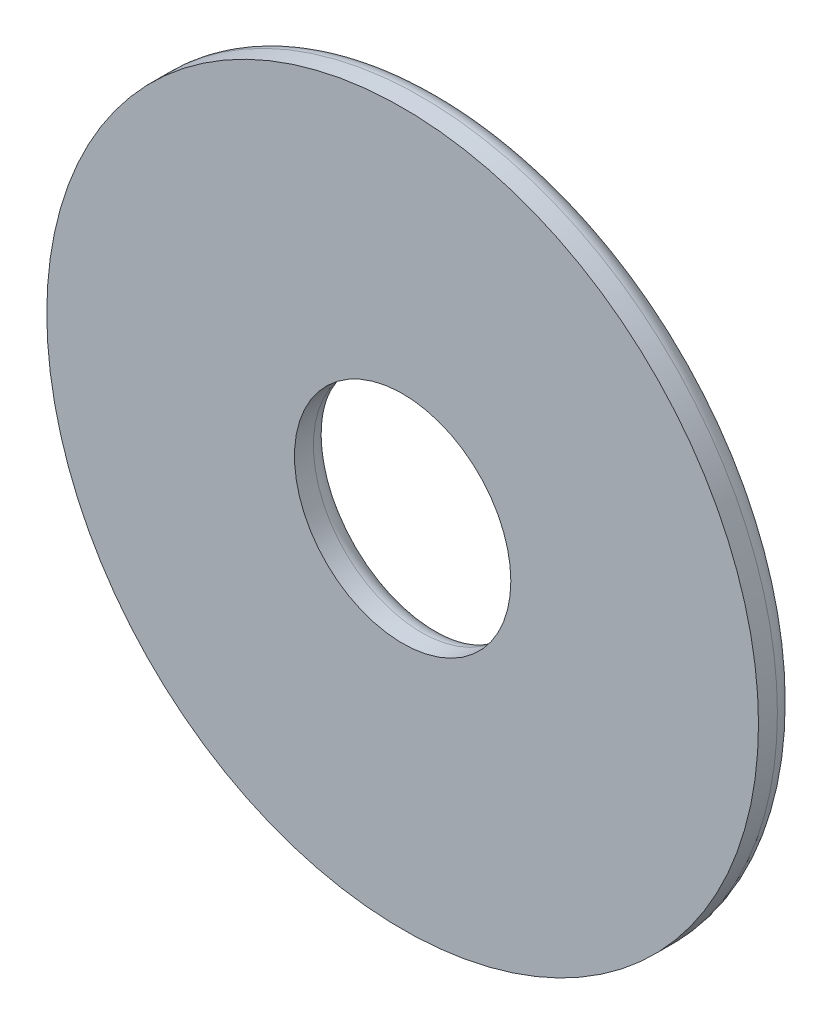
ISO-10303-21;
HEADER;
FILE_DESCRIPTION(('STEP AP214'),'2;1');
FILE_NAME('part.step','',(''),(''),'','','');
FILE_SCHEMA(('AUTOMOTIVE_DESIGN { 1 0 10303 214 1 1 1 1 }'));
ENDSEC;
DATA;
#1=APPLICATION_CONTEXT('core data for automotive mechanical design processes');
#2=APPLICATION_PROTOCOL_DEFINITION('international standard','automotive_design',2000,#1);
#3=PRODUCT_CONTEXT('',#1,'mechanical');
#4=PRODUCT('Part','Part','',(#3));
#5=PRODUCT_RELATED_PRODUCT_CATEGORY('part','',(#4));
#6=PRODUCT_DEFINITION_FORMATION('','',#4);
#7=PRODUCT_DEFINITION_CONTEXT('part definition',#1,'design');
#8=PRODUCT_DEFINITION('design','',#6,#7);
#9=PRODUCT_DEFINITION_SHAPE('','',#8);
#10=(LENGTH_UNIT() NAMED_UNIT(*) SI_UNIT(.MILLI.,.METRE.));
#11=(NAMED_UNIT(*) PLANE_ANGLE_UNIT() SI_UNIT($,.RADIAN.));
#12=(NAMED_UNIT(*) SI_UNIT($,.STERADIAN.) SOLID_ANGLE_UNIT());
#13=UNCERTAINTY_MEASURE_WITH_UNIT(LENGTH_MEASURE(1.E-05),#10,'distance_accuracy_value','');
#14=(GEOMETRIC_REPRESENTATION_CONTEXT(3) GLOBAL_UNCERTAINTY_ASSIGNED_CONTEXT((#13)) GLOBAL_UNIT_ASSIGNED_CONTEXT((#10,
#11,#12)) REPRESENTATION_CONTEXT('',''));
#15=CARTESIAN_POINT('',(0.,0.,0.));
#16=DIRECTION('',(0.,0.,1.));
#17=DIRECTION('',(1.,0.,0.));
#18=AXIS2_PLACEMENT_3D('',#15,#16,#17);
#19=CARTESIAN_POINT('',(0.,0.,0.590549999999995));
#20=DIRECTION('',(0.,0.,1.));
#21=DIRECTION('',(1.,0.,0.));
#22=AXIS2_PLACEMENT_3D('',#19,#20,#21);
#23=PLANE('',#22);
#24=CARTESIAN_POINT('',(0.,0.,0.590549999999995));
#25=DIRECTION('',(0.,0.,1.));
#26=DIRECTION('',(1.,0.,0.));
#27=AXIS2_PLACEMENT_3D('',#24,#25,#26);
#28=CIRCLE('',#27,11.1125);
#29=CARTESIAN_POINT('',(11.1125,0.,0.590549999999995));
#30=VERTEX_POINT('',#29);
#31=EDGE_CURVE('E54',#30,#30,#28,.T.);
#32=ORIENTED_EDGE('',*,*,#31,.T.);
#33=EDGE_LOOP('',(#32));
#34=FACE_BOUND('',#33,.T.);
#35=CARTESIAN_POINT('',(0.,0.,0.590549999999995));
#36=DIRECTION('',(0.,0.,1.));
#37=DIRECTION('',(1.,0.,0.));
#38=AXIS2_PLACEMENT_3D('',#35,#36,#37);
#39=CIRCLE('',#38,3.3782);
#40=CARTESIAN_POINT('',(3.3782,0.,0.590549999999995));
#41=VERTEX_POINT('',#40);
#42=EDGE_CURVE('E59',#41,#41,#39,.T.);
#43=ORIENTED_EDGE('',*,*,#42,.F.);
#44=EDGE_LOOP('',(#43));
#45=FACE_BOUND('',#44,.T.);
#46=ADVANCED_FACE('F34',(#34,#45),#23,.T.);
#47=CARTESIAN_POINT('',(0.,0.,0.590549999999995));
#48=DIRECTION('',(0.,0.,-1.));
#49=DIRECTION('',(-1.,0.,0.));
#50=AXIS2_PLACEMENT_3D('',#47,#48,#49);
#51=CYLINDRICAL_SURFACE('',#50,11.1125);
#52=CARTESIAN_POINT('',(0.,0.,0.));
#53=DIRECTION('',(0.,0.,1.));
#54=DIRECTION('',(1.,0.,0.));
#55=AXIS2_PLACEMENT_3D('',#52,#53,#54);
#56=CIRCLE('',#55,11.1125);
#57=CARTESIAN_POINT('',(11.1125,0.,0.));
#58=VERTEX_POINT('',#57);
#59=EDGE_CURVE('E49',#58,#58,#56,.T.);
#60=ORIENTED_EDGE('',*,*,#59,.T.);
#61=EDGE_LOOP('',(#60));
#62=FACE_BOUND('',#61,.T.);
#63=ORIENTED_EDGE('',*,*,#31,.F.);
#64=EDGE_LOOP('',(#63));
#65=FACE_BOUND('',#64,.T.);
#66=ADVANCED_FACE('F63',(#62,#65),#51,.T.);
#67=CARTESIAN_POINT('',(0.,0.,0.590549999999995));
#68=DIRECTION('',(0.,0.,-1.));
#69=DIRECTION('',(-1.,0.,0.));
#70=AXIS2_PLACEMENT_3D('',#67,#68,#69);
#71=CYLINDRICAL_SURFACE('',#70,3.3782);
#72=CARTESIAN_POINT('',(0.,0.,0.));
#73=DIRECTION('',(0.,0.,1.));
#74=DIRECTION('',(1.,0.,0.));
#75=AXIS2_PLACEMENT_3D('',#72,#73,#74);
#76=CIRCLE('',#75,3.3782);
#77=CARTESIAN_POINT('',(3.3782,0.,0.));
#78=VERTEX_POINT('',#77);
#79=EDGE_CURVE('E10',#78,#78,#76,.F.);
#80=ORIENTED_EDGE('',*,*,#79,.T.);
#81=EDGE_LOOP('',(#80));
#82=FACE_BOUND('',#81,.T.);
#83=ORIENTED_EDGE('',*,*,#42,.T.);
#84=EDGE_LOOP('',(#83));
#85=FACE_BOUND('',#84,.T.);
#86=ADVANCED_FACE('F65',(#82,#85),#71,.F.);
#87=CARTESIAN_POINT('',(0.,0.,-0.590549999999995));
#88=DIRECTION('',(0.,0.,1.));
#89=DIRECTION('',(1.,0.,0.));
#90=AXIS2_PLACEMENT_3D('',#87,#88,#89);
#91=PLANE('',#90);
#92=CARTESIAN_POINT('',(0.,0.,-0.590549999999995));
#93=DIRECTION('',(0.,0.,1.));
#94=DIRECTION('',(1.,0.,0.));
#95=AXIS2_PLACEMENT_3D('',#92,#93,#94);
#96=CIRCLE('',#95,10.52195);
#97=CARTESIAN_POINT('',(10.52195,0.,-0.590549999999995));
#98=VERTEX_POINT('',#97);
#99=EDGE_CURVE('E45',#98,#98,#96,.F.);
#100=ORIENTED_EDGE('',*,*,#99,.T.);
#101=EDGE_LOOP('',(#100));
#102=FACE_BOUND('',#101,.T.);
#103=CARTESIAN_POINT('',(0.,0.,-0.590549999999995));
#104=DIRECTION('',(0.,0.,1.));
#105=DIRECTION('',(1.,0.,0.));
#106=AXIS2_PLACEMENT_3D('',#103,#104,#105);
#107=CIRCLE('',#106,3.96875);
#108=CARTESIAN_POINT('',(3.96875,0.,-0.590549999999995));
#109=VERTEX_POINT('',#108);
#110=EDGE_CURVE('E46',#109,#109,#107,.T.);
#111=ORIENTED_EDGE('',*,*,#110,.T.);
#112=EDGE_LOOP('',(#111));
#113=FACE_BOUND('',#112,.T.);
#114=ADVANCED_FACE('F80',(#102,#113),#91,.F.);
#115=CARTESIAN_POINT('',(0.,0.,0.));
#116=DIRECTION('',(0.,0.,1.));
#117=DIRECTION('',(1.,0.,0.));
#118=AXIS2_PLACEMENT_3D('',#115,#116,#117);
#119=TOROIDAL_SURFACE('',#118,10.52195,0.59055);
#120=ORIENTED_EDGE('',*,*,#99,.F.);
#121=EDGE_LOOP('',(#120));
#122=FACE_BOUND('',#121,.T.);
#123=ORIENTED_EDGE('',*,*,#59,.F.);
#124=EDGE_LOOP('',(#123));
#125=FACE_BOUND('',#124,.T.);
#126=ADVANCED_FACE('F74',(#122,#125),#119,.T.);
#127=CARTESIAN_POINT('',(0.,0.,0.));
#128=DIRECTION('',(0.,0.,1.));
#129=DIRECTION('',(1.,0.,0.));
#130=AXIS2_PLACEMENT_3D('',#127,#128,#129);
#131=TOROIDAL_SURFACE('',#130,3.96875,0.59055);
#132=ORIENTED_EDGE('',*,*,#79,.F.);
#133=EDGE_LOOP('',(#132));
#134=FACE_BOUND('',#133,.T.);
#135=ORIENTED_EDGE('',*,*,#110,.F.);
#136=EDGE_LOOP('',(#135));
#137=FACE_BOUND('',#136,.T.);
#138=ADVANCED_FACE('F40',(#134,#137),#131,.T.);
#139=CLOSED_SHELL('',(#46,#66,#86,#114,#126,#138));
#140=MANIFOLD_SOLID_BREP('B2',#139);
#141=ADVANCED_BREP_SHAPE_REPRESENTATION('',(#18,#140),#14);
#142=SHAPE_DEFINITION_REPRESENTATION(#9,#141);
ENDSEC;
END-ISO-10303-21;
